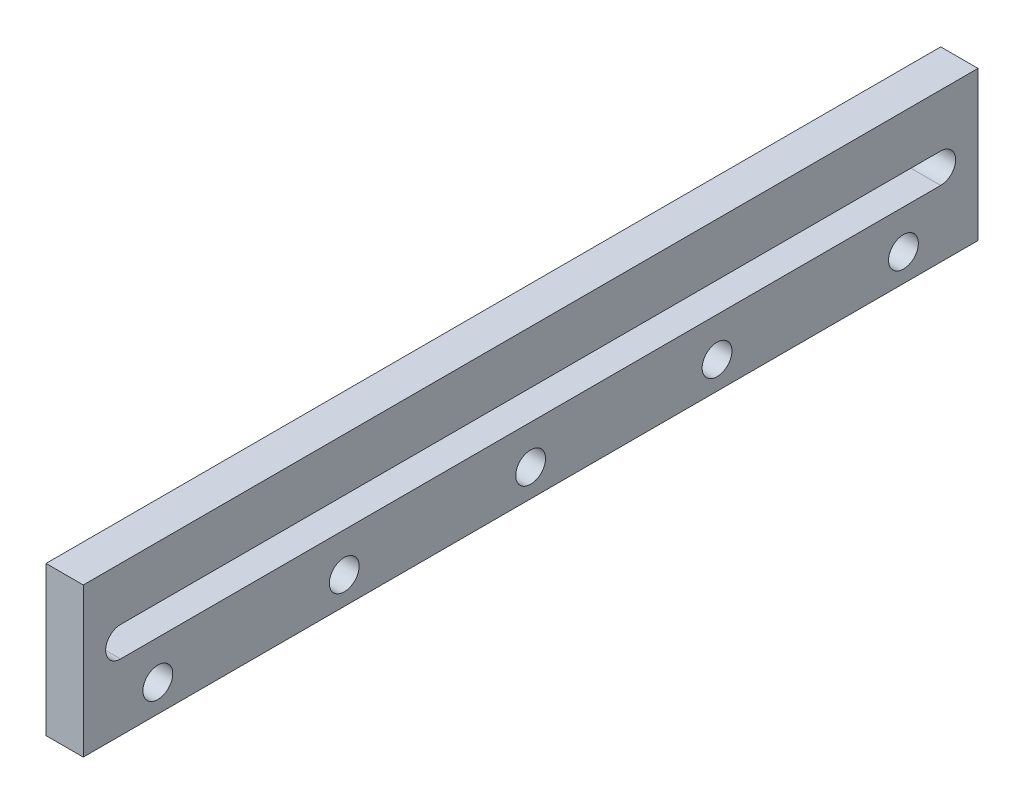
ISO-10303-21;
HEADER;
FILE_DESCRIPTION(('STEP AP214'),'2;1');
FILE_NAME('part.step','',(''),(''),'','','');
FILE_SCHEMA(('AUTOMOTIVE_DESIGN { 1 0 10303 214 1 1 1 1 }'));
ENDSEC;
DATA;
#1=APPLICATION_CONTEXT('core data for automotive mechanical design processes');
#2=APPLICATION_PROTOCOL_DEFINITION('international standard','automotive_design',2000,#1);
#3=PRODUCT_CONTEXT('',#1,'mechanical');
#4=PRODUCT('Part','Part','',(#3));
#5=PRODUCT_RELATED_PRODUCT_CATEGORY('part','',(#4));
#6=PRODUCT_DEFINITION_FORMATION('','',#4);
#7=PRODUCT_DEFINITION_CONTEXT('part definition',#1,'design');
#8=PRODUCT_DEFINITION('design','',#6,#7);
#9=PRODUCT_DEFINITION_SHAPE('','',#8);
#10=(LENGTH_UNIT() NAMED_UNIT(*) SI_UNIT(.MILLI.,.METRE.));
#11=(NAMED_UNIT(*) PLANE_ANGLE_UNIT() SI_UNIT($,.RADIAN.));
#12=(NAMED_UNIT(*) SI_UNIT($,.STERADIAN.) SOLID_ANGLE_UNIT());
#13=UNCERTAINTY_MEASURE_WITH_UNIT(LENGTH_MEASURE(1.E-05),#10,'distance_accuracy_value','');
#14=(GEOMETRIC_REPRESENTATION_CONTEXT(3) GLOBAL_UNCERTAINTY_ASSIGNED_CONTEXT((#13)) GLOBAL_UNIT_ASSIGNED_CONTEXT((#10,
#11,#12)) REPRESENTATION_CONTEXT('',''));
#15=CARTESIAN_POINT('',(0.,0.,0.));
#16=DIRECTION('',(0.,0.,1.));
#17=DIRECTION('',(1.,0.,0.));
#18=AXIS2_PLACEMENT_3D('',#15,#16,#17);
#19=CARTESIAN_POINT('',(5.,0.907447029850746,-55.));
#20=DIRECTION('',(-1.,0.,0.));
#21=DIRECTION('',(0.,0.,1.));
#22=AXIS2_PLACEMENT_3D('',#19,#20,#21);
#23=CYLINDRICAL_SURFACE('',#22,2.);
#24=CARTESIAN_POINT('',(0.,0.907447029850746,-55.));
#25=DIRECTION('',(1.,0.,0.));
#26=DIRECTION('',(0.,0.,-1.));
#27=AXIS2_PLACEMENT_3D('',#24,#25,#26);
#28=CIRCLE('',#27,2.);
#29=CARTESIAN_POINT('',(0.,-1.09255297014925,-55.));
#30=VERTEX_POINT('',#29);
#31=CARTESIAN_POINT('',(0.,2.90744702985075,-55.));
#32=VERTEX_POINT('',#31);
#33=EDGE_CURVE('E160',#30,#32,#28,.T.);
#34=ORIENTED_EDGE('',*,*,#33,.F.);
#35=DIRECTION('',(-1.,0.,0.));
#36=VECTOR('',#35,1.);
#37=CARTESIAN_POINT('',(5.,-1.09255297014925,-55.));
#38=LINE('',#37,#36);
#39=CARTESIAN_POINT('',(5.,-1.09255297014925,-55.));
#40=VERTEX_POINT('',#39);
#41=EDGE_CURVE('E11',#40,#30,#38,.T.);
#42=ORIENTED_EDGE('',*,*,#41,.F.);
#43=CARTESIAN_POINT('',(5.,0.907447029850746,-55.));
#44=DIRECTION('',(1.,0.,0.));
#45=DIRECTION('',(0.,0.,-1.));
#46=AXIS2_PLACEMENT_3D('',#43,#44,#45);
#47=CIRCLE('',#46,2.);
#48=CARTESIAN_POINT('',(5.,2.90744702985075,-55.));
#49=VERTEX_POINT('',#48);
#50=EDGE_CURVE('E125',#40,#49,#47,.T.);
#51=ORIENTED_EDGE('',*,*,#50,.T.);
#52=DIRECTION('',(-1.,0.,0.));
#53=VECTOR('',#52,1.);
#54=CARTESIAN_POINT('',(5.,2.90744702985075,-55.));
#55=LINE('',#54,#53);
#56=EDGE_CURVE('E55',#49,#32,#55,.T.);
#57=ORIENTED_EDGE('',*,*,#56,.T.);
#58=EDGE_LOOP('',(#34,#42,#51,#57));
#59=FACE_BOUND('',#58,.T.);
#60=ADVANCED_FACE('F36',(#59),#23,.F.);
#61=CARTESIAN_POINT('',(5.,-1.09255297014925,0.));
#62=DIRECTION('',(0.,1.,0.));
#63=DIRECTION('',(0.,0.,1.));
#64=AXIS2_PLACEMENT_3D('',#61,#62,#63);
#65=PLANE('',#64);
#66=DIRECTION('',(0.,0.,-1.));
#67=VECTOR('',#66,1.);
#68=CARTESIAN_POINT('',(0.,-1.09255297014925,0.));
#69=LINE('',#68,#67);
#70=CARTESIAN_POINT('',(0.,-1.09255297014925,55.));
#71=VERTEX_POINT('',#70);
#72=EDGE_CURVE('E113',#71,#30,#69,.T.);
#73=ORIENTED_EDGE('',*,*,#72,.F.);
#74=DIRECTION('',(-1.,0.,0.));
#75=VECTOR('',#74,1.);
#76=CARTESIAN_POINT('',(5.,-1.09255297014925,55.));
#77=LINE('',#76,#75);
#78=CARTESIAN_POINT('',(5.,-1.09255297014925,55.));
#79=VERTEX_POINT('',#78);
#80=EDGE_CURVE('E46',#79,#71,#77,.T.);
#81=ORIENTED_EDGE('',*,*,#80,.F.);
#82=DIRECTION('',(0.,0.,-1.));
#83=VECTOR('',#82,1.);
#84=CARTESIAN_POINT('',(5.,-1.09255297014925,0.));
#85=LINE('',#84,#83);
#86=EDGE_CURVE('E111',#79,#40,#85,.T.);
#87=ORIENTED_EDGE('',*,*,#86,.T.);
#88=ORIENTED_EDGE('',*,*,#41,.T.);
#89=EDGE_LOOP('',(#73,#81,#87,#88));
#90=FACE_BOUND('',#89,.T.);
#91=ADVANCED_FACE('F110',(#90),#65,.T.);
#92=CARTESIAN_POINT('',(5.,0.907447029850739,55.));
#93=DIRECTION('',(-1.,0.,0.));
#94=DIRECTION('',(0.,0.,1.));
#95=AXIS2_PLACEMENT_3D('',#92,#93,#94);
#96=CYLINDRICAL_SURFACE('',#95,1.99999999999999);
#97=CARTESIAN_POINT('',(0.,0.907447029850739,55.));
#98=DIRECTION('',(1.,0.,0.));
#99=DIRECTION('',(0.,0.,-1.));
#100=AXIS2_PLACEMENT_3D('',#97,#98,#99);
#101=CIRCLE('',#100,1.99999999999999);
#102=CARTESIAN_POINT('',(0.,2.90744702985073,55.));
#103=VERTEX_POINT('',#102);
#104=EDGE_CURVE('E163',#103,#71,#101,.T.);
#105=ORIENTED_EDGE('',*,*,#104,.F.);
#106=DIRECTION('',(-1.,0.,0.));
#107=VECTOR('',#106,1.);
#108=CARTESIAN_POINT('',(5.,2.90744702985073,55.));
#109=LINE('',#108,#107);
#110=CARTESIAN_POINT('',(5.,2.90744702985073,55.));
#111=VERTEX_POINT('',#110);
#112=EDGE_CURVE('E80',#111,#103,#109,.T.);
#113=ORIENTED_EDGE('',*,*,#112,.F.);
#114=CARTESIAN_POINT('',(5.,0.907447029850739,55.));
#115=DIRECTION('',(1.,0.,0.));
#116=DIRECTION('',(0.,0.,-1.));
#117=AXIS2_PLACEMENT_3D('',#114,#115,#116);
#118=CIRCLE('',#117,1.99999999999999);
#119=EDGE_CURVE('E124',#111,#79,#118,.T.);
#120=ORIENTED_EDGE('',*,*,#119,.T.);
#121=ORIENTED_EDGE('',*,*,#80,.T.);
#122=EDGE_LOOP('',(#105,#113,#120,#121));
#123=FACE_BOUND('',#122,.T.);
#124=ADVANCED_FACE('F127',(#123),#96,.F.);
#125=CARTESIAN_POINT('',(5.,-10.,0.));
#126=DIRECTION('',(0.,1.,0.));
#127=DIRECTION('',(0.,0.,1.));
#128=AXIS2_PLACEMENT_3D('',#125,#126,#127);
#129=PLANE('',#128);
#130=DIRECTION('',(0.,0.,-1.));
#131=VECTOR('',#130,1.);
#132=CARTESIAN_POINT('',(0.,-10.,0.));
#133=LINE('',#132,#131);
#134=CARTESIAN_POINT('',(0.,-10.,60.));
#135=VERTEX_POINT('',#134);
#136=CARTESIAN_POINT('',(0.,-10.,-60.));
#137=VERTEX_POINT('',#136);
#138=EDGE_CURVE('E146',#135,#137,#133,.T.);
#139=ORIENTED_EDGE('',*,*,#138,.T.);
#140=DIRECTION('',(-1.,0.,0.));
#141=VECTOR('',#140,1.);
#142=CARTESIAN_POINT('',(5.,-10.,-60.));
#143=LINE('',#142,#141);
#144=CARTESIAN_POINT('',(5.,-10.,-60.));
#145=VERTEX_POINT('',#144);
#146=EDGE_CURVE('E40',#145,#137,#143,.T.);
#147=ORIENTED_EDGE('',*,*,#146,.F.);
#148=DIRECTION('',(0.,0.,-1.));
#149=VECTOR('',#148,1.);
#150=CARTESIAN_POINT('',(5.,-10.,0.));
#151=LINE('',#150,#149);
#152=CARTESIAN_POINT('',(5.,-10.,60.));
#153=VERTEX_POINT('',#152);
#154=EDGE_CURVE('E93',#153,#145,#151,.T.);
#155=ORIENTED_EDGE('',*,*,#154,.F.);
#156=DIRECTION('',(-1.,0.,0.));
#157=VECTOR('',#156,1.);
#158=CARTESIAN_POINT('',(5.,-10.,60.));
#159=LINE('',#158,#157);
#160=EDGE_CURVE('E136',#153,#135,#159,.T.);
#161=ORIENTED_EDGE('',*,*,#160,.T.);
#162=EDGE_LOOP('',(#139,#147,#155,#161));
#163=FACE_BOUND('',#162,.T.);
#164=ADVANCED_FACE('F188',(#163),#129,.F.);
#165=CARTESIAN_POINT('',(5.,0.,-60.));
#166=DIRECTION('',(0.,0.,-1.));
#167=DIRECTION('',(-1.,0.,0.));
#168=AXIS2_PLACEMENT_3D('',#165,#166,#167);
#169=PLANE('',#168);
#170=DIRECTION('',(0.,-1.,0.));
#171=VECTOR('',#170,1.);
#172=CARTESIAN_POINT('',(0.,0.,-60.));
#173=LINE('',#172,#171);
#174=CARTESIAN_POINT('',(0.,10.,-60.));
#175=VERTEX_POINT('',#174);
#176=EDGE_CURVE('E149',#175,#137,#173,.T.);
#177=ORIENTED_EDGE('',*,*,#176,.F.);
#178=DIRECTION('',(-1.,0.,0.));
#179=VECTOR('',#178,1.);
#180=CARTESIAN_POINT('',(5.,10.,-60.));
#181=LINE('',#180,#179);
#182=CARTESIAN_POINT('',(5.,10.,-60.));
#183=VERTEX_POINT('',#182);
#184=EDGE_CURVE('E177',#183,#175,#181,.T.);
#185=ORIENTED_EDGE('',*,*,#184,.F.);
#186=DIRECTION('',(0.,-1.,0.));
#187=VECTOR('',#186,1.);
#188=CARTESIAN_POINT('',(5.,0.,-60.));
#189=LINE('',#188,#187);
#190=EDGE_CURVE('E185',#183,#145,#189,.T.);
#191=ORIENTED_EDGE('',*,*,#190,.T.);
#192=ORIENTED_EDGE('',*,*,#146,.T.);
#193=EDGE_LOOP('',(#177,#185,#191,#192));
#194=FACE_BOUND('',#193,.T.);
#195=ADVANCED_FACE('F184',(#194),#169,.T.);
#196=CARTESIAN_POINT('',(5.,10.,0.));
#197=DIRECTION('',(0.,1.,0.));
#198=DIRECTION('',(0.,0.,1.));
#199=AXIS2_PLACEMENT_3D('',#196,#197,#198);
#200=PLANE('',#199);
#201=DIRECTION('',(0.,0.,-1.));
#202=VECTOR('',#201,1.);
#203=CARTESIAN_POINT('',(0.,10.,0.));
#204=LINE('',#203,#202);
#205=CARTESIAN_POINT('',(0.,10.,60.));
#206=VERTEX_POINT('',#205);
#207=EDGE_CURVE('E152',#206,#175,#204,.T.);
#208=ORIENTED_EDGE('',*,*,#207,.F.);
#209=DIRECTION('',(-1.,0.,0.));
#210=VECTOR('',#209,1.);
#211=CARTESIAN_POINT('',(5.,10.,60.));
#212=LINE('',#211,#210);
#213=CARTESIAN_POINT('',(5.,10.,60.));
#214=VERTEX_POINT('',#213);
#215=EDGE_CURVE('E176',#214,#206,#212,.T.);
#216=ORIENTED_EDGE('',*,*,#215,.F.);
#217=DIRECTION('',(0.,0.,-1.));
#218=VECTOR('',#217,1.);
#219=CARTESIAN_POINT('',(5.,10.,0.));
#220=LINE('',#219,#218);
#221=EDGE_CURVE('E197',#214,#183,#220,.T.);
#222=ORIENTED_EDGE('',*,*,#221,.T.);
#223=ORIENTED_EDGE('',*,*,#184,.T.);
#224=EDGE_LOOP('',(#208,#216,#222,#223));
#225=FACE_BOUND('',#224,.T.);
#226=ADVANCED_FACE('F194',(#225),#200,.T.);
#227=CARTESIAN_POINT('',(5.,2.90744702985074,0.));
#228=DIRECTION('',(0.,-1.,0.));
#229=DIRECTION('',(0.,0.,-1.));
#230=AXIS2_PLACEMENT_3D('',#227,#228,#229);
#231=PLANE('',#230);
#232=DIRECTION('',(0.,0.,1.));
#233=VECTOR('',#232,1.);
#234=CARTESIAN_POINT('',(0.,2.90744702985074,0.));
#235=LINE('',#234,#233);
#236=EDGE_CURVE('E165',#32,#103,#235,.T.);
#237=ORIENTED_EDGE('',*,*,#236,.F.);
#238=ORIENTED_EDGE('',*,*,#56,.F.);
#239=DIRECTION('',(0.,0.,1.));
#240=VECTOR('',#239,1.);
#241=CARTESIAN_POINT('',(5.,2.90744702985074,0.));
#242=LINE('',#241,#240);
#243=EDGE_CURVE('E128',#49,#111,#242,.T.);
#244=ORIENTED_EDGE('',*,*,#243,.T.);
#245=ORIENTED_EDGE('',*,*,#112,.T.);
#246=EDGE_LOOP('',(#237,#238,#244,#245));
#247=FACE_BOUND('',#246,.T.);
#248=ADVANCED_FACE('F209',(#247),#231,.T.);
#249=CARTESIAN_POINT('',(5.,-6.30574582323393,50.));
#250=DIRECTION('',(-1.,0.,0.));
#251=DIRECTION('',(0.,0.,1.));
#252=AXIS2_PLACEMENT_3D('',#249,#250,#251);
#253=CYLINDRICAL_SURFACE('',#252,2.);
#254=CARTESIAN_POINT('',(5.,-6.30574582323393,50.));
#255=DIRECTION('',(1.,0.,0.));
#256=DIRECTION('',(0.,0.,-1.));
#257=AXIS2_PLACEMENT_3D('',#254,#255,#256);
#258=CIRCLE('',#257,2.);
#259=CARTESIAN_POINT('',(5.,-6.30574582323393,48.));
#260=VERTEX_POINT('',#259);
#261=EDGE_CURVE('E201',#260,#260,#258,.T.);
#262=ORIENTED_EDGE('',*,*,#261,.T.);
#263=EDGE_LOOP('',(#262));
#264=FACE_BOUND('',#263,.T.);
#265=CARTESIAN_POINT('',(0.,-6.30574582323393,50.));
#266=DIRECTION('',(1.,0.,0.));
#267=DIRECTION('',(0.,0.,-1.));
#268=AXIS2_PLACEMENT_3D('',#265,#266,#267);
#269=CIRCLE('',#268,2.);
#270=CARTESIAN_POINT('',(0.,-6.30574582323393,48.));
#271=VERTEX_POINT('',#270);
#272=EDGE_CURVE('E157',#271,#271,#269,.T.);
#273=ORIENTED_EDGE('',*,*,#272,.F.);
#274=EDGE_LOOP('',(#273));
#275=FACE_BOUND('',#274,.T.);
#276=ADVANCED_FACE('F211',(#264,#275),#253,.F.);
#277=CARTESIAN_POINT('',(5.,0.,60.));
#278=DIRECTION('',(0.,0.,-1.));
#279=DIRECTION('',(-1.,0.,0.));
#280=AXIS2_PLACEMENT_3D('',#277,#278,#279);
#281=PLANE('',#280);
#282=DIRECTION('',(0.,-1.,0.));
#283=VECTOR('',#282,1.);
#284=CARTESIAN_POINT('',(0.,0.,60.));
#285=LINE('',#284,#283);
#286=EDGE_CURVE('E155',#206,#135,#285,.T.);
#287=ORIENTED_EDGE('',*,*,#286,.T.);
#288=ORIENTED_EDGE('',*,*,#160,.F.);
#289=DIRECTION('',(0.,-1.,0.));
#290=VECTOR('',#289,1.);
#291=CARTESIAN_POINT('',(5.,0.,60.));
#292=LINE('',#291,#290);
#293=EDGE_CURVE('E199',#214,#153,#292,.T.);
#294=ORIENTED_EDGE('',*,*,#293,.F.);
#295=ORIENTED_EDGE('',*,*,#215,.T.);
#296=EDGE_LOOP('',(#287,#288,#294,#295));
#297=FACE_BOUND('',#296,.T.);
#298=ADVANCED_FACE('F200',(#297),#281,.F.);
#299=CARTESIAN_POINT('',(5.,-6.30574582323393,-50.));
#300=DIRECTION('',(-1.,0.,0.));
#301=DIRECTION('',(0.,0.,1.));
#302=AXIS2_PLACEMENT_3D('',#299,#300,#301);
#303=CYLINDRICAL_SURFACE('',#302,2.);
#304=CARTESIAN_POINT('',(5.,-6.30574582323393,-50.));
#305=DIRECTION('',(1.,0.,0.));
#306=DIRECTION('',(0.,0.,-1.));
#307=AXIS2_PLACEMENT_3D('',#304,#305,#306);
#308=CIRCLE('',#307,2.);
#309=CARTESIAN_POINT('',(5.,-6.30574582323393,-52.));
#310=VERTEX_POINT('',#309);
#311=EDGE_CURVE('E366',#310,#310,#308,.T.);
#312=ORIENTED_EDGE('',*,*,#311,.T.);
#313=EDGE_LOOP('',(#312));
#314=FACE_BOUND('',#313,.T.);
#315=CARTESIAN_POINT('',(0.,-6.30574582323393,-50.));
#316=DIRECTION('',(1.,0.,0.));
#317=DIRECTION('',(0.,0.,-1.));
#318=AXIS2_PLACEMENT_3D('',#315,#316,#317);
#319=CIRCLE('',#318,2.);
#320=CARTESIAN_POINT('',(0.,-6.30574582323393,-52.));
#321=VERTEX_POINT('',#320);
#322=EDGE_CURVE('E143',#321,#321,#319,.T.);
#323=ORIENTED_EDGE('',*,*,#322,.F.);
#324=EDGE_LOOP('',(#323));
#325=FACE_BOUND('',#324,.T.);
#326=ADVANCED_FACE('F230',(#314,#325),#303,.F.);
#327=CARTESIAN_POINT('',(5.,-6.30574582323393,-25.));
#328=DIRECTION('',(-1.,0.,0.));
#329=DIRECTION('',(0.,0.,1.));
#330=AXIS2_PLACEMENT_3D('',#327,#328,#329);
#331=CYLINDRICAL_SURFACE('',#330,2.);
#332=CARTESIAN_POINT('',(5.,-6.30574582323393,-25.));
#333=DIRECTION('',(1.,0.,0.));
#334=DIRECTION('',(0.,0.,-1.));
#335=AXIS2_PLACEMENT_3D('',#332,#333,#334);
#336=CIRCLE('',#335,2.);
#337=CARTESIAN_POINT('',(5.,-6.30574582323393,-27.));
#338=VERTEX_POINT('',#337);
#339=EDGE_CURVE('E249',#338,#338,#336,.T.);
#340=ORIENTED_EDGE('',*,*,#339,.T.);
#341=EDGE_LOOP('',(#340));
#342=FACE_BOUND('',#341,.T.);
#343=CARTESIAN_POINT('',(0.,-6.30574582323393,-25.));
#344=DIRECTION('',(1.,0.,0.));
#345=DIRECTION('',(0.,0.,-1.));
#346=AXIS2_PLACEMENT_3D('',#343,#344,#345);
#347=CIRCLE('',#346,2.);
#348=CARTESIAN_POINT('',(0.,-6.30574582323393,-27.));
#349=VERTEX_POINT('',#348);
#350=EDGE_CURVE('E140',#349,#349,#347,.T.);
#351=ORIENTED_EDGE('',*,*,#350,.F.);
#352=EDGE_LOOP('',(#351));
#353=FACE_BOUND('',#352,.T.);
#354=ADVANCED_FACE('F237',(#342,#353),#331,.F.);
#355=CARTESIAN_POINT('',(5.,-6.30574582323393,0.));
#356=DIRECTION('',(-1.,0.,0.));
#357=DIRECTION('',(0.,0.,1.));
#358=AXIS2_PLACEMENT_3D('',#355,#356,#357);
#359=CYLINDRICAL_SURFACE('',#358,2.);
#360=CARTESIAN_POINT('',(5.,-6.30574582323393,0.));
#361=DIRECTION('',(1.,0.,0.));
#362=DIRECTION('',(0.,0.,-1.));
#363=AXIS2_PLACEMENT_3D('',#360,#361,#362);
#364=CIRCLE('',#363,2.);
#365=CARTESIAN_POINT('',(5.,-6.30574582323393,-2.00000000000001));
#366=VERTEX_POINT('',#365);
#367=EDGE_CURVE('E171',#366,#366,#364,.T.);
#368=ORIENTED_EDGE('',*,*,#367,.T.);
#369=EDGE_LOOP('',(#368));
#370=FACE_BOUND('',#369,.T.);
#371=CARTESIAN_POINT('',(0.,-6.30574582323393,0.));
#372=DIRECTION('',(1.,0.,0.));
#373=DIRECTION('',(0.,0.,-1.));
#374=AXIS2_PLACEMENT_3D('',#371,#372,#373);
#375=CIRCLE('',#374,2.);
#376=CARTESIAN_POINT('',(0.,-6.30574582323393,-2.00000000000001));
#377=VERTEX_POINT('',#376);
#378=EDGE_CURVE('E137',#377,#377,#375,.T.);
#379=ORIENTED_EDGE('',*,*,#378,.F.);
#380=EDGE_LOOP('',(#379));
#381=FACE_BOUND('',#380,.T.);
#382=ADVANCED_FACE('F38',(#370,#381),#359,.F.);
#383=CARTESIAN_POINT('',(5.,-6.30574582323393,25.));
#384=DIRECTION('',(-1.,0.,0.));
#385=DIRECTION('',(0.,0.,1.));
#386=AXIS2_PLACEMENT_3D('',#383,#384,#385);
#387=CYLINDRICAL_SURFACE('',#386,2.);
#388=CARTESIAN_POINT('',(5.,-6.30574582323393,25.));
#389=DIRECTION('',(1.,0.,0.));
#390=DIRECTION('',(0.,0.,-1.));
#391=AXIS2_PLACEMENT_3D('',#388,#389,#390);
#392=CIRCLE('',#391,2.);
#393=CARTESIAN_POINT('',(5.,-6.30574582323393,23.));
#394=VERTEX_POINT('',#393);
#395=EDGE_CURVE('E130',#394,#394,#392,.T.);
#396=ORIENTED_EDGE('',*,*,#395,.T.);
#397=EDGE_LOOP('',(#396));
#398=FACE_BOUND('',#397,.T.);
#399=CARTESIAN_POINT('',(0.,-6.30574582323393,25.));
#400=DIRECTION('',(1.,0.,0.));
#401=DIRECTION('',(0.,0.,-1.));
#402=AXIS2_PLACEMENT_3D('',#399,#400,#401);
#403=CIRCLE('',#402,2.);
#404=CARTESIAN_POINT('',(0.,-6.30574582323393,23.));
#405=VERTEX_POINT('',#404);
#406=EDGE_CURVE('E168',#405,#405,#403,.T.);
#407=ORIENTED_EDGE('',*,*,#406,.F.);
#408=EDGE_LOOP('',(#407));
#409=FACE_BOUND('',#408,.T.);
#410=ADVANCED_FACE('F244',(#398,#409),#387,.F.);
#411=CARTESIAN_POINT('',(5.,0.,0.));
#412=DIRECTION('',(1.,0.,0.));
#413=DIRECTION('',(0.,0.,-1.));
#414=AXIS2_PLACEMENT_3D('',#411,#412,#413);
#415=PLANE('',#414);
#416=ORIENTED_EDGE('',*,*,#367,.F.);
#417=EDGE_LOOP('',(#416));
#418=FACE_BOUND('',#417,.T.);
#419=ORIENTED_EDGE('',*,*,#339,.F.);
#420=EDGE_LOOP('',(#419));
#421=FACE_BOUND('',#420,.T.);
#422=ORIENTED_EDGE('',*,*,#311,.F.);
#423=EDGE_LOOP('',(#422));
#424=FACE_BOUND('',#423,.T.);
#425=ORIENTED_EDGE('',*,*,#154,.T.);
#426=ORIENTED_EDGE('',*,*,#190,.F.);
#427=ORIENTED_EDGE('',*,*,#221,.F.);
#428=ORIENTED_EDGE('',*,*,#293,.T.);
#429=EDGE_LOOP('',(#425,#426,#427,#428));
#430=FACE_BOUND('',#429,.T.);
#431=ORIENTED_EDGE('',*,*,#261,.F.);
#432=EDGE_LOOP('',(#431));
#433=FACE_BOUND('',#432,.T.);
#434=ORIENTED_EDGE('',*,*,#50,.F.);
#435=ORIENTED_EDGE('',*,*,#86,.F.);
#436=ORIENTED_EDGE('',*,*,#119,.F.);
#437=ORIENTED_EDGE('',*,*,#243,.F.);
#438=EDGE_LOOP('',(#434,#435,#436,#437));
#439=FACE_BOUND('',#438,.T.);
#440=ORIENTED_EDGE('',*,*,#395,.F.);
#441=EDGE_LOOP('',(#440));
#442=FACE_BOUND('',#441,.T.);
#443=ADVANCED_FACE('F121',(#418,#421,#424,#430,#433,#439,#442),#415,.T.);
#444=CARTESIAN_POINT('',(0.,0.,0.));
#445=DIRECTION('',(1.,0.,0.));
#446=DIRECTION('',(0.,0.,-1.));
#447=AXIS2_PLACEMENT_3D('',#444,#445,#446);
#448=PLANE('',#447);
#449=ORIENTED_EDGE('',*,*,#378,.T.);
#450=EDGE_LOOP('',(#449));
#451=FACE_BOUND('',#450,.T.);
#452=ORIENTED_EDGE('',*,*,#350,.T.);
#453=EDGE_LOOP('',(#452));
#454=FACE_BOUND('',#453,.T.);
#455=ORIENTED_EDGE('',*,*,#322,.T.);
#456=EDGE_LOOP('',(#455));
#457=FACE_BOUND('',#456,.T.);
#458=ORIENTED_EDGE('',*,*,#138,.F.);
#459=ORIENTED_EDGE('',*,*,#286,.F.);
#460=ORIENTED_EDGE('',*,*,#207,.T.);
#461=ORIENTED_EDGE('',*,*,#176,.T.);
#462=EDGE_LOOP('',(#458,#459,#460,#461));
#463=FACE_BOUND('',#462,.T.);
#464=ORIENTED_EDGE('',*,*,#272,.T.);
#465=EDGE_LOOP('',(#464));
#466=FACE_BOUND('',#465,.T.);
#467=ORIENTED_EDGE('',*,*,#33,.T.);
#468=ORIENTED_EDGE('',*,*,#236,.T.);
#469=ORIENTED_EDGE('',*,*,#104,.T.);
#470=ORIENTED_EDGE('',*,*,#72,.T.);
#471=EDGE_LOOP('',(#467,#468,#469,#470));
#472=FACE_BOUND('',#471,.T.);
#473=ORIENTED_EDGE('',*,*,#406,.T.);
#474=EDGE_LOOP('',(#473));
#475=FACE_BOUND('',#474,.T.);
#476=ADVANCED_FACE('F192',(#451,#454,#457,#463,#466,#472,#475),#448,.F.);
#477=CLOSED_SHELL('',(#60,#91,#124,#164,#195,#226,#248,#276,#298,#326,#354,#382,#410,#443,#476));
#478=MANIFOLD_SOLID_BREP('B2',#477);
#479=ADVANCED_BREP_SHAPE_REPRESENTATION('',(#18,#478),#14);
#480=SHAPE_DEFINITION_REPRESENTATION(#9,#479);
ENDSEC;
END-ISO-10303-21;
